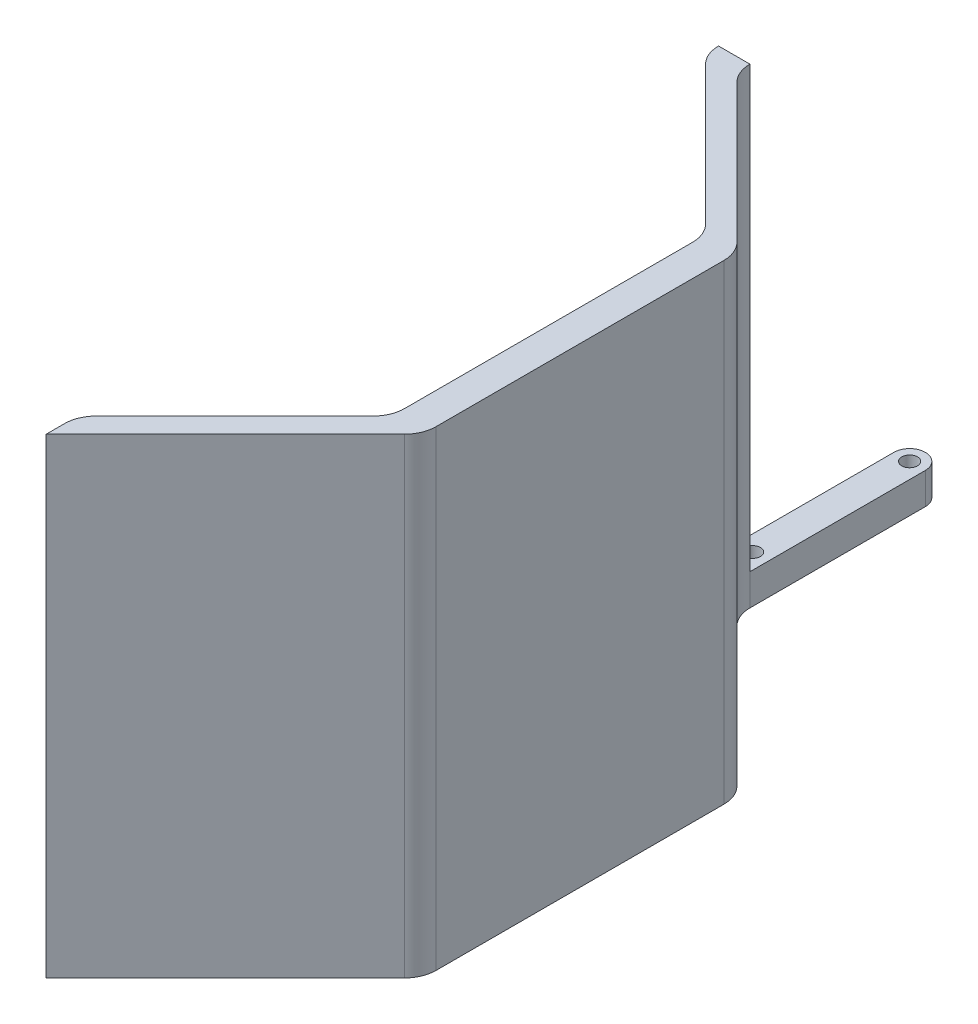
ISO-10303-21;
HEADER;
FILE_DESCRIPTION(('STEP AP214'),'2;1');
FILE_NAME('part.step','',(''),(''),'','','');
FILE_SCHEMA(('AUTOMOTIVE_DESIGN { 1 0 10303 214 1 1 1 1 }'));
ENDSEC;
DATA;
#1=APPLICATION_CONTEXT('core data for automotive mechanical design processes');
#2=APPLICATION_PROTOCOL_DEFINITION('international standard','automotive_design',2000,#1);
#3=PRODUCT_CONTEXT('',#1,'mechanical');
#4=PRODUCT('Part','Part','',(#3));
#5=PRODUCT_RELATED_PRODUCT_CATEGORY('part','',(#4));
#6=PRODUCT_DEFINITION_FORMATION('','',#4);
#7=PRODUCT_DEFINITION_CONTEXT('part definition',#1,'design');
#8=PRODUCT_DEFINITION('design','',#6,#7);
#9=PRODUCT_DEFINITION_SHAPE('','',#8);
#10=(LENGTH_UNIT() NAMED_UNIT(*) SI_UNIT(.MILLI.,.METRE.));
#11=(NAMED_UNIT(*) PLANE_ANGLE_UNIT() SI_UNIT($,.RADIAN.));
#12=(NAMED_UNIT(*) SI_UNIT($,.STERADIAN.) SOLID_ANGLE_UNIT());
#13=UNCERTAINTY_MEASURE_WITH_UNIT(LENGTH_MEASURE(1.E-05),#10,'distance_accuracy_value','');
#14=(GEOMETRIC_REPRESENTATION_CONTEXT(3) GLOBAL_UNCERTAINTY_ASSIGNED_CONTEXT((#13)) GLOBAL_UNIT_ASSIGNED_CONTEXT((#10,
#11,#12)) REPRESENTATION_CONTEXT('',''));
#15=CARTESIAN_POINT('',(0.,0.,0.));
#16=DIRECTION('',(0.,0.,1.));
#17=DIRECTION('',(1.,0.,0.));
#18=AXIS2_PLACEMENT_3D('',#15,#16,#17);
#19=CARTESIAN_POINT('',(83.9293710518805,150.,-1.98835945574279E-13));
#20=DIRECTION('',(1.,0.,0.));
#21=DIRECTION('',(0.,0.,-1.));
#22=AXIS2_PLACEMENT_3D('',#19,#20,#21);
#23=PLANE('',#22);
#24=DIRECTION('',(0.,-1.,0.));
#25=VECTOR('',#24,1.);
#26=CARTESIAN_POINT('',(83.9293710518805,150.,-45.9986158011053));
#27=LINE('',#26,#25);
#28=CARTESIAN_POINT('',(83.9293710518805,9.99999999999998,-45.9986158011053));
#29=VERTEX_POINT('',#28);
#30=CARTESIAN_POINT('',(83.9293710518805,0.,-45.9986158011053));
#31=VERTEX_POINT('',#30);
#32=EDGE_CURVE('E241',#29,#31,#27,.T.);
#33=ORIENTED_EDGE('',*,*,#32,.F.);
#34=DIRECTION('',(0.,0.,-1.));
#35=VECTOR('',#34,1.);
#36=CARTESIAN_POINT('',(83.9293710518805,9.99999999999998,-45.9986158011053));
#37=LINE('',#36,#35);
#38=CARTESIAN_POINT('',(83.9293710518805,9.99999999999998,9.85924857516376));
#39=VERTEX_POINT('',#38);
#40=EDGE_CURVE('E282',#39,#29,#37,.T.);
#41=ORIENTED_EDGE('',*,*,#40,.F.);
#42=DIRECTION('',(0.,-1.,0.));
#43=VECTOR('',#42,1.);
#44=CARTESIAN_POINT('',(83.9293710518805,150.,9.85924857516368));
#45=LINE('',#44,#43);
#46=CARTESIAN_POINT('',(83.9293710518805,0.,9.85924857516368));
#47=VERTEX_POINT('',#46);
#48=EDGE_CURVE('E243',#39,#47,#45,.T.);
#49=ORIENTED_EDGE('',*,*,#48,.T.);
#50=DIRECTION('',(0.,0.,1.));
#51=VECTOR('',#50,1.);
#52=CARTESIAN_POINT('',(83.9293710518805,0.,-1.98835945574279E-13));
#53=LINE('',#52,#51);
#54=EDGE_CURVE('E231',#31,#47,#53,.T.);
#55=ORIENTED_EDGE('',*,*,#54,.F.);
#56=EDGE_LOOP('',(#33,#41,#49,#55));
#57=FACE_BOUND('',#56,.T.);
#58=ADVANCED_FACE('F38',(#57),#23,.T.);
#59=CARTESIAN_POINT('',(78.9293710518805,150.,-45.9986158011053));
#60=DIRECTION('',(0.,-1.,0.));
#61=DIRECTION('',(0.,0.,-1.));
#62=AXIS2_PLACEMENT_3D('',#59,#60,#61);
#63=CYLINDRICAL_SURFACE('',#62,5.);
#64=CARTESIAN_POINT('',(78.9293710518805,9.99999999999998,-45.9986158011053));
#65=DIRECTION('',(0.,1.,0.));
#66=DIRECTION('',(0.,0.,1.));
#67=AXIS2_PLACEMENT_3D('',#64,#65,#66);
#68=CIRCLE('',#67,5.);
#69=CARTESIAN_POINT('',(73.9293710518805,9.99999999999998,-45.9986158011052));
#70=VERTEX_POINT('',#69);
#71=EDGE_CURVE('E285',#29,#70,#68,.T.);
#72=ORIENTED_EDGE('',*,*,#71,.F.);
#73=ORIENTED_EDGE('',*,*,#32,.T.);
#74=CARTESIAN_POINT('',(78.9293710518805,0.,-45.9986158011053));
#75=DIRECTION('',(0.,1.,0.));
#76=DIRECTION('',(0.,0.,1.));
#77=AXIS2_PLACEMENT_3D('',#74,#75,#76);
#78=CIRCLE('',#77,5.);
#79=CARTESIAN_POINT('',(73.9293710518805,0.,-45.9986158011053));
#80=VERTEX_POINT('',#79);
#81=EDGE_CURVE('E234',#31,#80,#78,.T.);
#82=ORIENTED_EDGE('',*,*,#81,.T.);
#83=DIRECTION('',(0.,-1.,0.));
#84=VECTOR('',#83,1.);
#85=CARTESIAN_POINT('',(73.9293710518805,150.,-45.9986158011053));
#86=LINE('',#85,#84);
#87=EDGE_CURVE('E114',#70,#80,#86,.T.);
#88=ORIENTED_EDGE('',*,*,#87,.F.);
#89=EDGE_LOOP('',(#72,#73,#82,#88));
#90=FACE_BOUND('',#89,.T.);
#91=ADVANCED_FACE('F345',(#90),#63,.T.);
#92=CARTESIAN_POINT('',(73.9293710518805,150.,0.));
#93=DIRECTION('',(1.,0.,0.));
#94=DIRECTION('',(0.,0.,-1.));
#95=AXIS2_PLACEMENT_3D('',#92,#93,#94);
#96=PLANE('',#95);
#97=DIRECTION('',(0.,0.,1.));
#98=VECTOR('',#97,1.);
#99=CARTESIAN_POINT('',(73.9293710518805,9.99999999999998,9.85924857516374));
#100=LINE('',#99,#98);
#101=CARTESIAN_POINT('',(73.9293710518805,9.99999999999998,9.85924857516374));
#102=VERTEX_POINT('',#101);
#103=EDGE_CURVE('E288',#70,#102,#100,.T.);
#104=ORIENTED_EDGE('',*,*,#103,.F.);
#105=ORIENTED_EDGE('',*,*,#87,.T.);
#106=DIRECTION('',(0.,0.,1.));
#107=VECTOR('',#106,1.);
#108=CARTESIAN_POINT('',(73.9293710518805,0.,0.));
#109=LINE('',#108,#107);
#110=CARTESIAN_POINT('',(73.9293710518805,0.,9.85924857516374));
#111=VERTEX_POINT('',#110);
#112=EDGE_CURVE('E236',#80,#111,#109,.T.);
#113=ORIENTED_EDGE('',*,*,#112,.T.);
#114=DIRECTION('',(0.,-1.,0.));
#115=VECTOR('',#114,1.);
#116=CARTESIAN_POINT('',(73.9293710518805,150.,9.85924857516374));
#117=LINE('',#116,#115);
#118=EDGE_CURVE('E121',#102,#111,#117,.T.);
#119=ORIENTED_EDGE('',*,*,#118,.F.);
#120=EDGE_LOOP('',(#104,#105,#113,#119));
#121=FACE_BOUND('',#120,.T.);
#122=ADVANCED_FACE('F348',(#121),#96,.F.);
#123=CARTESIAN_POINT('',(83.9293710518805,150.,9.85924857516378));
#124=DIRECTION('',(0.,-1.,0.));
#125=DIRECTION('',(0.,0.,-1.));
#126=AXIS2_PLACEMENT_3D('',#123,#124,#125);
#127=CYLINDRICAL_SURFACE('',#126,10.);
#128=CARTESIAN_POINT('',(83.9293710518805,0.,9.85924857516378));
#129=DIRECTION('',(0.,1.,0.));
#130=DIRECTION('',(0.,0.,1.));
#131=AXIS2_PLACEMENT_3D('',#128,#129,#130);
#132=CIRCLE('',#131,10.);
#133=CARTESIAN_POINT('',(76.8583032400151,0.,16.9303163870293));
#134=VERTEX_POINT('',#133);
#135=EDGE_CURVE('E193',#134,#111,#132,.F.);
#136=ORIENTED_EDGE('',*,*,#135,.F.);
#137=DIRECTION('',(0.,-1.,0.));
#138=VECTOR('',#137,1.);
#139=CARTESIAN_POINT('',(76.8583032400151,150.,16.9303163870293));
#140=LINE('',#139,#138);
#141=CARTESIAN_POINT('',(76.8583032400151,150.,16.9303163870293));
#142=VERTEX_POINT('',#141);
#143=EDGE_CURVE('E11',#142,#134,#140,.T.);
#144=ORIENTED_EDGE('',*,*,#143,.F.);
#145=CARTESIAN_POINT('',(83.9293710518805,150.,9.85924857516378));
#146=DIRECTION('',(0.,1.,0.));
#147=DIRECTION('',(0.,0.,1.));
#148=AXIS2_PLACEMENT_3D('',#145,#146,#147);
#149=CIRCLE('',#148,10.);
#150=CARTESIAN_POINT('',(73.9293710518805,150.,9.85924857516374));
#151=VERTEX_POINT('',#150);
#152=EDGE_CURVE('E238',#142,#151,#149,.F.);
#153=ORIENTED_EDGE('',*,*,#152,.T.);
#154=EDGE_CURVE('E57',#151,#102,#117,.T.);
#155=ORIENTED_EDGE('',*,*,#154,.T.);
#156=ORIENTED_EDGE('',*,*,#118,.T.);
#157=EDGE_LOOP('',(#136,#144,#153,#155,#156));
#158=FACE_BOUND('',#157,.T.);
#159=ADVANCED_FACE('F40',(#158),#127,.T.);
#160=CARTESIAN_POINT('',(29.9639934264929,150.,-29.9639934264929));
#161=DIRECTION('',(0.707106781186548,0.,-0.707106781186547));
#162=DIRECTION('',(-0.707106781186547,0.,-0.707106781186548));
#163=AXIS2_PLACEMENT_3D('',#160,#161,#162);
#164=PLANE('',#163);
#165=DIRECTION('',(0.707106781186547,0.,0.707106781186548));
#166=VECTOR('',#165,1.);
#167=CARTESIAN_POINT('',(29.9639934264929,0.,-29.9639934264929));
#168=LINE('',#167,#166);
#169=CARTESIAN_POINT('',(121.000438863746,0.,61.0724520107602));
#170=VERTEX_POINT('',#169);
#171=EDGE_CURVE('E196',#134,#170,#168,.T.);
#172=ORIENTED_EDGE('',*,*,#171,.T.);
#173=DIRECTION('',(0.,-1.,0.));
#174=VECTOR('',#173,1.);
#175=CARTESIAN_POINT('',(121.000438863746,150.,61.0724520107602));
#176=LINE('',#175,#174);
#177=CARTESIAN_POINT('',(121.000438863746,150.,61.0724520107602));
#178=VERTEX_POINT('',#177);
#179=EDGE_CURVE('E48',#178,#170,#176,.T.);
#180=ORIENTED_EDGE('',*,*,#179,.F.);
#181=DIRECTION('',(0.707106781186547,0.,0.707106781186548));
#182=VECTOR('',#181,1.);
#183=CARTESIAN_POINT('',(29.9639934264929,150.,-29.9639934264929));
#184=LINE('',#183,#182);
#185=EDGE_CURVE('E295',#142,#178,#184,.T.);
#186=ORIENTED_EDGE('',*,*,#185,.F.);
#187=ORIENTED_EDGE('',*,*,#143,.T.);
#188=EDGE_LOOP('',(#172,#180,#186,#187));
#189=FACE_BOUND('',#188,.T.);
#190=ADVANCED_FACE('F352',(#189),#164,.F.);
#191=CARTESIAN_POINT('',(113.929371051881,150.,68.1435198226257));
#192=DIRECTION('',(0.,-1.,0.));
#193=DIRECTION('',(0.,0.,-1.));
#194=AXIS2_PLACEMENT_3D('',#191,#192,#193);
#195=CYLINDRICAL_SURFACE('',#194,9.99999999999999);
#196=CARTESIAN_POINT('',(113.929371051881,0.,68.1435198226257));
#197=DIRECTION('',(0.,1.,0.));
#198=DIRECTION('',(0.,0.,1.));
#199=AXIS2_PLACEMENT_3D('',#196,#197,#198);
#200=CIRCLE('',#199,9.99999999999999);
#201=CARTESIAN_POINT('',(123.92937105188,0.,68.1435198226257));
#202=VERTEX_POINT('',#201);
#203=EDGE_CURVE('E200',#202,#170,#200,.T.);
#204=ORIENTED_EDGE('',*,*,#203,.F.);
#205=DIRECTION('',(0.,-1.,0.));
#206=VECTOR('',#205,1.);
#207=CARTESIAN_POINT('',(123.92937105188,150.,68.1435198226257));
#208=LINE('',#207,#206);
#209=CARTESIAN_POINT('',(123.92937105188,150.,68.1435198226257));
#210=VERTEX_POINT('',#209);
#211=EDGE_CURVE('E265',#210,#202,#208,.T.);
#212=ORIENTED_EDGE('',*,*,#211,.F.);
#213=CARTESIAN_POINT('',(113.929371051881,150.,68.1435198226257));
#214=DIRECTION('',(0.,1.,0.));
#215=DIRECTION('',(0.,0.,1.));
#216=AXIS2_PLACEMENT_3D('',#213,#214,#215);
#217=CIRCLE('',#216,9.99999999999999);
#218=EDGE_CURVE('E297',#210,#178,#217,.T.);
#219=ORIENTED_EDGE('',*,*,#218,.T.);
#220=ORIENTED_EDGE('',*,*,#179,.T.);
#221=EDGE_LOOP('',(#204,#212,#219,#220));
#222=FACE_BOUND('',#221,.T.);
#223=ADVANCED_FACE('F355',(#222),#195,.F.);
#224=CARTESIAN_POINT('',(123.92937105188,150.,0.));
#225=DIRECTION('',(1.,0.,0.));
#226=DIRECTION('',(0.,0.,-1.));
#227=AXIS2_PLACEMENT_3D('',#224,#225,#226);
#228=PLANE('',#227);
#229=DIRECTION('',(0.,0.,1.));
#230=VECTOR('',#229,1.);
#231=CARTESIAN_POINT('',(123.92937105188,0.,0.));
#232=LINE('',#231,#230);
#233=CARTESIAN_POINT('',(123.929371051881,0.,159.859248575164));
#234=VERTEX_POINT('',#233);
#235=EDGE_CURVE('E203',#202,#234,#232,.T.);
#236=ORIENTED_EDGE('',*,*,#235,.T.);
#237=DIRECTION('',(0.,-1.,0.));
#238=VECTOR('',#237,1.);
#239=CARTESIAN_POINT('',(123.929371051881,150.,159.859248575164));
#240=LINE('',#239,#238);
#241=CARTESIAN_POINT('',(123.929371051881,150.,159.859248575164));
#242=VERTEX_POINT('',#241);
#243=EDGE_CURVE('E262',#242,#234,#240,.T.);
#244=ORIENTED_EDGE('',*,*,#243,.F.);
#245=DIRECTION('',(0.,0.,1.));
#246=VECTOR('',#245,1.);
#247=CARTESIAN_POINT('',(123.92937105188,150.,0.));
#248=LINE('',#247,#246);
#249=EDGE_CURVE('E300',#210,#242,#248,.T.);
#250=ORIENTED_EDGE('',*,*,#249,.F.);
#251=ORIENTED_EDGE('',*,*,#211,.T.);
#252=EDGE_LOOP('',(#236,#244,#250,#251));
#253=FACE_BOUND('',#252,.T.);
#254=ADVANCED_FACE('F360',(#253),#228,.F.);
#255=CARTESIAN_POINT('',(113.929371051881,150.,159.859248575164));
#256=DIRECTION('',(0.,-1.,0.));
#257=DIRECTION('',(0.,0.,-1.));
#258=AXIS2_PLACEMENT_3D('',#255,#256,#257);
#259=CYLINDRICAL_SURFACE('',#258,10.);
#260=CARTESIAN_POINT('',(113.929371051881,0.,159.859248575164));
#261=DIRECTION('',(0.,1.,0.));
#262=DIRECTION('',(0.,0.,1.));
#263=AXIS2_PLACEMENT_3D('',#260,#261,#262);
#264=CIRCLE('',#263,10.);
#265=CARTESIAN_POINT('',(121.000438863746,0.,166.930316387029));
#266=VERTEX_POINT('',#265);
#267=EDGE_CURVE('E205',#234,#266,#264,.F.);
#268=ORIENTED_EDGE('',*,*,#267,.T.);
#269=DIRECTION('',(0.,-1.,0.));
#270=VECTOR('',#269,1.);
#271=CARTESIAN_POINT('',(121.000438863746,150.,166.930316387029));
#272=LINE('',#271,#270);
#273=CARTESIAN_POINT('',(121.000438863746,150.,166.930316387029));
#274=VERTEX_POINT('',#273);
#275=EDGE_CURVE('E259',#274,#266,#272,.T.);
#276=ORIENTED_EDGE('',*,*,#275,.F.);
#277=CARTESIAN_POINT('',(113.929371051881,150.,159.859248575164));
#278=DIRECTION('',(0.,1.,0.));
#279=DIRECTION('',(0.,0.,1.));
#280=AXIS2_PLACEMENT_3D('',#277,#278,#279);
#281=CIRCLE('',#280,10.);
#282=EDGE_CURVE('E302',#242,#274,#281,.F.);
#283=ORIENTED_EDGE('',*,*,#282,.F.);
#284=ORIENTED_EDGE('',*,*,#243,.T.);
#285=EDGE_LOOP('',(#268,#276,#283,#284));
#286=FACE_BOUND('',#285,.T.);
#287=ADVANCED_FACE('F367',(#286),#259,.F.);
#288=CARTESIAN_POINT('',(143.965377625386,150.,143.96537762539));
#289=DIRECTION('',(0.707106781186537,0.,0.707106781186558));
#290=DIRECTION('',(0.707106781186558,0.,-0.707106781186537));
#291=AXIS2_PLACEMENT_3D('',#288,#289,#290);
#292=PLANE('',#291);
#293=DIRECTION('',(-0.707106781186558,0.,0.707106781186537));
#294=VECTOR('',#293,1.);
#295=CARTESIAN_POINT('',(143.965377625386,0.,143.96537762539));
#296=LINE('',#295,#294);
#297=CARTESIAN_POINT('',(76.8583032400138,0.,211.07245201076));
#298=VERTEX_POINT('',#297);
#299=EDGE_CURVE('E207',#266,#298,#296,.T.);
#300=ORIENTED_EDGE('',*,*,#299,.T.);
#301=DIRECTION('',(0.,-1.,0.));
#302=VECTOR('',#301,1.);
#303=CARTESIAN_POINT('',(76.8583032400138,150.,211.07245201076));
#304=LINE('',#303,#302);
#305=CARTESIAN_POINT('',(76.8583032400138,150.,211.07245201076));
#306=VERTEX_POINT('',#305);
#307=EDGE_CURVE('E257',#306,#298,#304,.T.);
#308=ORIENTED_EDGE('',*,*,#307,.F.);
#309=DIRECTION('',(-0.707106781186558,0.,0.707106781186537));
#310=VECTOR('',#309,1.);
#311=CARTESIAN_POINT('',(143.965377625386,150.,143.96537762539));
#312=LINE('',#311,#310);
#313=EDGE_CURVE('E304',#274,#306,#312,.T.);
#314=ORIENTED_EDGE('',*,*,#313,.F.);
#315=ORIENTED_EDGE('',*,*,#275,.T.);
#316=EDGE_LOOP('',(#300,#308,#314,#315));
#317=FACE_BOUND('',#316,.T.);
#318=ADVANCED_FACE('F371',(#317),#292,.F.);
#319=CARTESIAN_POINT('',(83.9293710518805,150.,218.143519822626));
#320=DIRECTION('',(0.,-1.,0.));
#321=DIRECTION('',(0.,0.,-1.));
#322=AXIS2_PLACEMENT_3D('',#319,#320,#321);
#323=CYLINDRICAL_SURFACE('',#322,10.0000000000005);
#324=CARTESIAN_POINT('',(83.9293710518805,0.,218.143519822626));
#325=DIRECTION('',(0.,1.,0.));
#326=DIRECTION('',(0.,0.,1.));
#327=AXIS2_PLACEMENT_3D('',#324,#325,#326);
#328=CIRCLE('',#327,10.0000000000005);
#329=CARTESIAN_POINT('',(73.9293710518805,0.,218.143519822626));
#330=VERTEX_POINT('',#329);
#331=EDGE_CURVE('E210',#330,#298,#328,.F.);
#332=ORIENTED_EDGE('',*,*,#331,.F.);
#333=DIRECTION('',(0.,-1.,0.));
#334=VECTOR('',#333,1.);
#335=CARTESIAN_POINT('',(73.9293710518805,150.,218.143519822626));
#336=LINE('',#335,#334);
#337=CARTESIAN_POINT('',(73.9293710518805,150.,218.143519822626));
#338=VERTEX_POINT('',#337);
#339=EDGE_CURVE('E255',#338,#330,#336,.T.);
#340=ORIENTED_EDGE('',*,*,#339,.F.);
#341=CARTESIAN_POINT('',(83.9293710518805,150.,218.143519822626));
#342=DIRECTION('',(0.,1.,0.));
#343=DIRECTION('',(0.,0.,1.));
#344=AXIS2_PLACEMENT_3D('',#341,#342,#343);
#345=CIRCLE('',#344,10.0000000000005);
#346=EDGE_CURVE('E306',#338,#306,#345,.F.);
#347=ORIENTED_EDGE('',*,*,#346,.T.);
#348=ORIENTED_EDGE('',*,*,#307,.T.);
#349=EDGE_LOOP('',(#332,#340,#347,#348));
#350=FACE_BOUND('',#349,.T.);
#351=ADVANCED_FACE('F374',(#350),#323,.T.);
#352=CARTESIAN_POINT('',(73.9293710518805,150.,0.));
#353=DIRECTION('',(-1.,0.,0.));
#354=DIRECTION('',(0.,0.,1.));
#355=AXIS2_PLACEMENT_3D('',#352,#353,#354);
#356=PLANE('',#355);
#357=DIRECTION('',(0.,0.,-1.));
#358=VECTOR('',#357,1.);
#359=CARTESIAN_POINT('',(73.9293710518805,0.,0.));
#360=LINE('',#359,#358);
#361=CARTESIAN_POINT('',(73.9293710518806,0.,224.001384198897));
#362=VERTEX_POINT('',#361);
#363=EDGE_CURVE('E213',#362,#330,#360,.T.);
#364=ORIENTED_EDGE('',*,*,#363,.F.);
#365=DIRECTION('',(0.,-1.,0.));
#366=VECTOR('',#365,1.);
#367=CARTESIAN_POINT('',(73.9293710518806,150.,224.001384198897));
#368=LINE('',#367,#366);
#369=CARTESIAN_POINT('',(73.9293710518806,150.,224.001384198897));
#370=VERTEX_POINT('',#369);
#371=EDGE_CURVE('E253',#370,#362,#368,.T.);
#372=ORIENTED_EDGE('',*,*,#371,.F.);
#373=DIRECTION('',(0.,0.,-1.));
#374=VECTOR('',#373,1.);
#375=CARTESIAN_POINT('',(73.9293710518805,150.,0.));
#376=LINE('',#375,#374);
#377=EDGE_CURVE('E309',#370,#338,#376,.T.);
#378=ORIENTED_EDGE('',*,*,#377,.T.);
#379=ORIENTED_EDGE('',*,*,#339,.T.);
#380=EDGE_LOOP('',(#364,#372,#378,#379));
#381=FACE_BOUND('',#380,.T.);
#382=ADVANCED_FACE('F379',(#381),#356,.T.);
#383=CARTESIAN_POINT('',(148.96537762539,150.,148.965377625386));
#384=DIRECTION('',(0.707106781186556,0.,0.707106781186539));
#385=DIRECTION('',(0.707106781186539,0.,-0.707106781186556));
#386=AXIS2_PLACEMENT_3D('',#383,#384,#385);
#387=PLANE('',#386);
#388=DIRECTION('',(-0.707106781186539,0.,0.707106781186556));
#389=VECTOR('',#388,1.);
#390=CARTESIAN_POINT('',(148.96537762539,0.,148.965377625386));
#391=LINE('',#390,#389);
#392=CARTESIAN_POINT('',(131.000438863747,0.,166.930316387029));
#393=VERTEX_POINT('',#392);
#394=EDGE_CURVE('E216',#393,#362,#391,.T.);
#395=ORIENTED_EDGE('',*,*,#394,.F.);
#396=DIRECTION('',(0.,-1.,0.));
#397=VECTOR('',#396,1.);
#398=CARTESIAN_POINT('',(131.000438863747,150.,166.930316387029));
#399=LINE('',#398,#397);
#400=CARTESIAN_POINT('',(131.000438863747,150.,166.930316387029));
#401=VERTEX_POINT('',#400);
#402=EDGE_CURVE('E251',#401,#393,#399,.T.);
#403=ORIENTED_EDGE('',*,*,#402,.F.);
#404=DIRECTION('',(-0.707106781186539,0.,0.707106781186556));
#405=VECTOR('',#404,1.);
#406=CARTESIAN_POINT('',(148.96537762539,150.,148.965377625386));
#407=LINE('',#406,#405);
#408=EDGE_CURVE('E312',#401,#370,#407,.T.);
#409=ORIENTED_EDGE('',*,*,#408,.T.);
#410=ORIENTED_EDGE('',*,*,#371,.T.);
#411=EDGE_LOOP('',(#395,#403,#409,#410));
#412=FACE_BOUND('',#411,.T.);
#413=ADVANCED_FACE('F382',(#412),#387,.T.);
#414=CARTESIAN_POINT('',(123.929371051882,150.,159.859248575164));
#415=DIRECTION('',(0.,-1.,0.));
#416=DIRECTION('',(0.,0.,-1.));
#417=AXIS2_PLACEMENT_3D('',#414,#415,#416);
#418=CYLINDRICAL_SURFACE('',#417,10.);
#419=CARTESIAN_POINT('',(123.929371051882,0.,159.859248575164));
#420=DIRECTION('',(0.,1.,0.));
#421=DIRECTION('',(0.,0.,1.));
#422=AXIS2_PLACEMENT_3D('',#419,#420,#421);
#423=CIRCLE('',#422,10.);
#424=CARTESIAN_POINT('',(133.929371051882,0.,159.859248575164));
#425=VERTEX_POINT('',#424);
#426=EDGE_CURVE('E219',#425,#393,#423,.F.);
#427=ORIENTED_EDGE('',*,*,#426,.F.);
#428=DIRECTION('',(0.,-1.,0.));
#429=VECTOR('',#428,1.);
#430=CARTESIAN_POINT('',(133.929371051882,150.,159.859248575164));
#431=LINE('',#430,#429);
#432=CARTESIAN_POINT('',(133.929371051882,150.,159.859248575164));
#433=VERTEX_POINT('',#432);
#434=EDGE_CURVE('E249',#433,#425,#431,.T.);
#435=ORIENTED_EDGE('',*,*,#434,.F.);
#436=CARTESIAN_POINT('',(123.929371051882,150.,159.859248575164));
#437=DIRECTION('',(0.,1.,0.));
#438=DIRECTION('',(0.,0.,1.));
#439=AXIS2_PLACEMENT_3D('',#436,#437,#438);
#440=CIRCLE('',#439,10.);
#441=EDGE_CURVE('E315',#433,#401,#440,.F.);
#442=ORIENTED_EDGE('',*,*,#441,.T.);
#443=ORIENTED_EDGE('',*,*,#402,.T.);
#444=EDGE_LOOP('',(#427,#435,#442,#443));
#445=FACE_BOUND('',#444,.T.);
#446=ADVANCED_FACE('F384',(#445),#418,.T.);
#447=CARTESIAN_POINT('',(133.929371051882,150.,0.));
#448=DIRECTION('',(1.,0.,0.));
#449=DIRECTION('',(0.,0.,-1.));
#450=AXIS2_PLACEMENT_3D('',#447,#448,#449);
#451=PLANE('',#450);
#452=DIRECTION('',(0.,0.,1.));
#453=VECTOR('',#452,1.);
#454=CARTESIAN_POINT('',(133.929371051882,0.,0.));
#455=LINE('',#454,#453);
#456=CARTESIAN_POINT('',(133.929371051882,0.,68.1435198226258));
#457=VERTEX_POINT('',#456);
#458=EDGE_CURVE('E222',#457,#425,#455,.T.);
#459=ORIENTED_EDGE('',*,*,#458,.F.);
#460=DIRECTION('',(0.,-1.,0.));
#461=VECTOR('',#460,1.);
#462=CARTESIAN_POINT('',(133.929371051882,150.,68.1435198226258));
#463=LINE('',#462,#461);
#464=CARTESIAN_POINT('',(133.929371051882,150.,68.1435198226258));
#465=VERTEX_POINT('',#464);
#466=EDGE_CURVE('E173',#465,#457,#463,.T.);
#467=ORIENTED_EDGE('',*,*,#466,.F.);
#468=DIRECTION('',(0.,0.,1.));
#469=VECTOR('',#468,1.);
#470=CARTESIAN_POINT('',(133.929371051882,150.,0.));
#471=LINE('',#470,#469);
#472=EDGE_CURVE('E184',#465,#433,#471,.T.);
#473=ORIENTED_EDGE('',*,*,#472,.T.);
#474=ORIENTED_EDGE('',*,*,#434,.T.);
#475=EDGE_LOOP('',(#459,#467,#473,#474));
#476=FACE_BOUND('',#475,.T.);
#477=ADVANCED_FACE('F319',(#476),#451,.T.);
#478=CARTESIAN_POINT('',(123.929371051882,150.,68.1435198226257));
#479=DIRECTION('',(0.,-1.,0.));
#480=DIRECTION('',(0.,0.,-1.));
#481=AXIS2_PLACEMENT_3D('',#478,#479,#480);
#482=CYLINDRICAL_SURFACE('',#481,10.);
#483=CARTESIAN_POINT('',(123.929371051882,0.,68.1435198226257));
#484=DIRECTION('',(0.,1.,0.));
#485=DIRECTION('',(0.,0.,1.));
#486=AXIS2_PLACEMENT_3D('',#483,#484,#485);
#487=CIRCLE('',#486,10.);
#488=CARTESIAN_POINT('',(131.000438863747,0.,61.0724520107602));
#489=VERTEX_POINT('',#488);
#490=EDGE_CURVE('E168',#489,#457,#487,.F.);
#491=ORIENTED_EDGE('',*,*,#490,.F.);
#492=DIRECTION('',(0.,-1.,0.));
#493=VECTOR('',#492,1.);
#494=CARTESIAN_POINT('',(131.000438863747,150.,61.0724520107602));
#495=LINE('',#494,#493);
#496=CARTESIAN_POINT('',(131.000438863747,150.,61.0724520107602));
#497=VERTEX_POINT('',#496);
#498=EDGE_CURVE('E163',#497,#489,#495,.T.);
#499=ORIENTED_EDGE('',*,*,#498,.F.);
#500=CARTESIAN_POINT('',(123.929371051882,150.,68.1435198226257));
#501=DIRECTION('',(0.,1.,0.));
#502=DIRECTION('',(0.,0.,1.));
#503=AXIS2_PLACEMENT_3D('',#500,#501,#502);
#504=CIRCLE('',#503,10.);
#505=EDGE_CURVE('E166',#497,#465,#504,.F.);
#506=ORIENTED_EDGE('',*,*,#505,.T.);
#507=ORIENTED_EDGE('',*,*,#466,.T.);
#508=EDGE_LOOP('',(#491,#499,#506,#507));
#509=FACE_BOUND('',#508,.T.);
#510=ADVANCED_FACE('F165',(#509),#482,.T.);
#511=CARTESIAN_POINT('',(34.9639934264919,150.,-34.9639934264927));
#512=DIRECTION('',(0.707106781186539,0.,-0.707106781186556));
#513=DIRECTION('',(-0.707106781186556,0.,-0.707106781186539));
#514=AXIS2_PLACEMENT_3D('',#511,#512,#513);
#515=PLANE('',#514);
#516=DIRECTION('',(0.707106781186556,0.,0.707106781186539));
#517=VECTOR('',#516,1.);
#518=CARTESIAN_POINT('',(34.9639934264919,0.,-34.9639934264927));
#519=LINE('',#518,#517);
#520=CARTESIAN_POINT('',(86.8583032400151,0.,16.9303163870293));
#521=VERTEX_POINT('',#520);
#522=EDGE_CURVE('E226',#521,#489,#519,.T.);
#523=ORIENTED_EDGE('',*,*,#522,.F.);
#524=DIRECTION('',(0.,-1.,0.));
#525=VECTOR('',#524,1.);
#526=CARTESIAN_POINT('',(86.8583032400151,150.,16.9303163870293));
#527=LINE('',#526,#525);
#528=CARTESIAN_POINT('',(86.8583032400151,150.,16.9303163870293));
#529=VERTEX_POINT('',#528);
#530=EDGE_CURVE('E174',#529,#521,#527,.T.);
#531=ORIENTED_EDGE('',*,*,#530,.F.);
#532=DIRECTION('',(0.707106781186556,0.,0.707106781186539));
#533=VECTOR('',#532,1.);
#534=CARTESIAN_POINT('',(34.9639934264919,150.,-34.9639934264927));
#535=LINE('',#534,#533);
#536=EDGE_CURVE('E181',#529,#497,#535,.T.);
#537=ORIENTED_EDGE('',*,*,#536,.T.);
#538=ORIENTED_EDGE('',*,*,#498,.T.);
#539=EDGE_LOOP('',(#523,#531,#537,#538));
#540=FACE_BOUND('',#539,.T.);
#541=ADVANCED_FACE('F186',(#540),#515,.T.);
#542=CARTESIAN_POINT('',(93.9293710518805,150.,9.85924857516369));
#543=DIRECTION('',(0.,-1.,0.));
#544=DIRECTION('',(0.,0.,-1.));
#545=AXIS2_PLACEMENT_3D('',#542,#543,#544);
#546=CYLINDRICAL_SURFACE('',#545,10.);
#547=CARTESIAN_POINT('',(93.9293710518805,0.,9.85924857516369));
#548=DIRECTION('',(0.,1.,0.));
#549=DIRECTION('',(0.,0.,1.));
#550=AXIS2_PLACEMENT_3D('',#547,#548,#549);
#551=CIRCLE('',#550,10.);
#552=EDGE_CURVE('E228',#521,#47,#551,.F.);
#553=ORIENTED_EDGE('',*,*,#552,.T.);
#554=ORIENTED_EDGE('',*,*,#48,.F.);
#555=CARTESIAN_POINT('',(83.9293710518805,150.,9.85924857516376));
#556=VERTEX_POINT('',#555);
#557=EDGE_CURVE('E244',#556,#39,#45,.T.);
#558=ORIENTED_EDGE('',*,*,#557,.F.);
#559=CARTESIAN_POINT('',(93.9293710518805,150.,9.85924857516369));
#560=DIRECTION('',(0.,1.,0.));
#561=DIRECTION('',(0.,0.,1.));
#562=AXIS2_PLACEMENT_3D('',#559,#560,#561);
#563=CIRCLE('',#562,10.);
#564=EDGE_CURVE('E188',#529,#556,#563,.F.);
#565=ORIENTED_EDGE('',*,*,#564,.F.);
#566=ORIENTED_EDGE('',*,*,#530,.T.);
#567=EDGE_LOOP('',(#553,#554,#558,#565,#566));
#568=FACE_BOUND('',#567,.T.);
#569=ADVANCED_FACE('F328',(#568),#546,.F.);
#570=CARTESIAN_POINT('',(0.,150.,0.));
#571=DIRECTION('',(0.,1.,0.));
#572=DIRECTION('',(0.,0.,1.));
#573=AXIS2_PLACEMENT_3D('',#570,#571,#572);
#574=PLANE('',#573);
#575=DIRECTION('',(1.,0.,0.));
#576=VECTOR('',#575,1.);
#577=CARTESIAN_POINT('',(83.9293710518805,150.,9.85924857516376));
#578=LINE('',#577,#576);
#579=EDGE_CURVE('E273',#151,#556,#578,.T.);
#580=ORIENTED_EDGE('',*,*,#579,.F.);
#581=ORIENTED_EDGE('',*,*,#152,.F.);
#582=ORIENTED_EDGE('',*,*,#185,.T.);
#583=ORIENTED_EDGE('',*,*,#218,.F.);
#584=ORIENTED_EDGE('',*,*,#249,.T.);
#585=ORIENTED_EDGE('',*,*,#282,.T.);
#586=ORIENTED_EDGE('',*,*,#313,.T.);
#587=ORIENTED_EDGE('',*,*,#346,.F.);
#588=ORIENTED_EDGE('',*,*,#377,.F.);
#589=ORIENTED_EDGE('',*,*,#408,.F.);
#590=ORIENTED_EDGE('',*,*,#441,.F.);
#591=ORIENTED_EDGE('',*,*,#472,.F.);
#592=ORIENTED_EDGE('',*,*,#505,.F.);
#593=ORIENTED_EDGE('',*,*,#536,.F.);
#594=ORIENTED_EDGE('',*,*,#564,.T.);
#595=EDGE_LOOP('',(#580,#581,#582,#583,#584,#585,#586,#587,#588,#589,#590,#591,#592,#593,#594));
#596=FACE_BOUND('',#595,.T.);
#597=ADVANCED_FACE('F179',(#596),#574,.T.);
#598=CARTESIAN_POINT('',(0.,0.,0.));
#599=DIRECTION('',(0.,1.,0.));
#600=DIRECTION('',(0.,0.,1.));
#601=AXIS2_PLACEMENT_3D('',#598,#599,#600);
#602=PLANE('',#601);
#603=CARTESIAN_POINT('',(78.9293710518805,0.,-45.9986158011053));
#604=DIRECTION('',(0.,-1.,0.));
#605=DIRECTION('',(0.,0.,-1.));
#606=AXIS2_PLACEMENT_3D('',#603,#604,#605);
#607=CIRCLE('',#606,2.5);
#608=CARTESIAN_POINT('',(78.9293710518805,0.,-48.4986158011053));
#609=VERTEX_POINT('',#608);
#610=EDGE_CURVE('E269',#609,#609,#607,.T.);
#611=ORIENTED_EDGE('',*,*,#610,.F.);
#612=EDGE_LOOP('',(#611));
#613=FACE_BOUND('',#612,.T.);
#614=CARTESIAN_POINT('',(78.9293710518805,0.,4.00138419889474));
#615=DIRECTION('',(0.,-1.,0.));
#616=DIRECTION('',(0.,0.,-1.));
#617=AXIS2_PLACEMENT_3D('',#614,#615,#616);
#618=CIRCLE('',#617,2.5);
#619=CARTESIAN_POINT('',(78.9293710518805,0.,1.50138419889475));
#620=VERTEX_POINT('',#619);
#621=EDGE_CURVE('E275',#620,#620,#618,.T.);
#622=ORIENTED_EDGE('',*,*,#621,.F.);
#623=EDGE_LOOP('',(#622));
#624=FACE_BOUND('',#623,.T.);
#625=ORIENTED_EDGE('',*,*,#135,.T.);
#626=ORIENTED_EDGE('',*,*,#112,.F.);
#627=ORIENTED_EDGE('',*,*,#81,.F.);
#628=ORIENTED_EDGE('',*,*,#54,.T.);
#629=ORIENTED_EDGE('',*,*,#552,.F.);
#630=ORIENTED_EDGE('',*,*,#522,.T.);
#631=ORIENTED_EDGE('',*,*,#490,.T.);
#632=ORIENTED_EDGE('',*,*,#458,.T.);
#633=ORIENTED_EDGE('',*,*,#426,.T.);
#634=ORIENTED_EDGE('',*,*,#394,.T.);
#635=ORIENTED_EDGE('',*,*,#363,.T.);
#636=ORIENTED_EDGE('',*,*,#331,.T.);
#637=ORIENTED_EDGE('',*,*,#299,.F.);
#638=ORIENTED_EDGE('',*,*,#267,.F.);
#639=ORIENTED_EDGE('',*,*,#235,.F.);
#640=ORIENTED_EDGE('',*,*,#203,.T.);
#641=ORIENTED_EDGE('',*,*,#171,.F.);
#642=EDGE_LOOP('',(#625,#626,#627,#628,#629,#630,#631,#632,#633,#634,#635,#636,#637,#638,#639,
#640,#641));
#643=FACE_BOUND('',#642,.T.);
#644=ADVANCED_FACE('F322',(#613,#624,#643),#602,.F.);
#645=CARTESIAN_POINT('',(83.9293710518805,9.99999999999998,9.85924857516376));
#646=DIRECTION('',(0.,0.,1.));
#647=DIRECTION('',(1.,0.,0.));
#648=AXIS2_PLACEMENT_3D('',#645,#646,#647);
#649=PLANE('',#648);
#650=ORIENTED_EDGE('',*,*,#579,.T.);
#651=ORIENTED_EDGE('',*,*,#557,.T.);
#652=DIRECTION('',(1.,0.,0.));
#653=VECTOR('',#652,1.);
#654=CARTESIAN_POINT('',(83.9293710518805,9.99999999999998,9.85924857516376));
#655=LINE('',#654,#653);
#656=EDGE_CURVE('E197',#102,#39,#655,.T.);
#657=ORIENTED_EDGE('',*,*,#656,.F.);
#658=ORIENTED_EDGE('',*,*,#154,.F.);
#659=EDGE_LOOP('',(#650,#651,#657,#658));
#660=FACE_BOUND('',#659,.T.);
#661=ADVANCED_FACE('F340',(#660),#649,.F.);
#662=CARTESIAN_POINT('',(78.9293710518805,9.99999999999998,-45.9986158011053));
#663=DIRECTION('',(0.,1.,0.));
#664=DIRECTION('',(0.,0.,1.));
#665=AXIS2_PLACEMENT_3D('',#662,#663,#664);
#666=PLANE('',#665);
#667=CARTESIAN_POINT('',(78.9293710518805,9.99999999999998,-45.9986158011053));
#668=DIRECTION('',(0.,1.,0.));
#669=DIRECTION('',(0.,0.,1.));
#670=AXIS2_PLACEMENT_3D('',#667,#668,#669);
#671=CIRCLE('',#670,2.5);
#672=CARTESIAN_POINT('',(78.9293710518805,9.99999999999998,-43.4986158011053));
#673=VERTEX_POINT('',#672);
#674=EDGE_CURVE('E42',#673,#673,#671,.T.);
#675=ORIENTED_EDGE('',*,*,#674,.F.);
#676=EDGE_LOOP('',(#675));
#677=FACE_BOUND('',#676,.T.);
#678=CARTESIAN_POINT('',(78.9293710518805,9.99999999999998,4.00138419889474));
#679=DIRECTION('',(0.,1.,0.));
#680=DIRECTION('',(0.,0.,1.));
#681=AXIS2_PLACEMENT_3D('',#678,#679,#680);
#682=CIRCLE('',#681,2.5);
#683=CARTESIAN_POINT('',(78.9293710518805,9.99999999999998,6.50138419889474));
#684=VERTEX_POINT('',#683);
#685=EDGE_CURVE('E267',#684,#684,#682,.T.);
#686=ORIENTED_EDGE('',*,*,#685,.F.);
#687=EDGE_LOOP('',(#686));
#688=FACE_BOUND('',#687,.T.);
#689=ORIENTED_EDGE('',*,*,#40,.T.);
#690=ORIENTED_EDGE('',*,*,#71,.T.);
#691=ORIENTED_EDGE('',*,*,#103,.T.);
#692=ORIENTED_EDGE('',*,*,#656,.T.);
#693=EDGE_LOOP('',(#689,#690,#691,#692));
#694=FACE_BOUND('',#693,.T.);
#695=ADVANCED_FACE('F341',(#677,#688,#694),#666,.T.);
#696=CARTESIAN_POINT('',(78.9293710518805,150.,4.00138419889474));
#697=DIRECTION('',(0.,-1.,0.));
#698=DIRECTION('',(0.,0.,-1.));
#699=AXIS2_PLACEMENT_3D('',#696,#697,#698);
#700=CYLINDRICAL_SURFACE('',#699,2.5);
#701=ORIENTED_EDGE('',*,*,#685,.T.);
#702=EDGE_LOOP('',(#701));
#703=FACE_BOUND('',#702,.T.);
#704=ORIENTED_EDGE('',*,*,#621,.T.);
#705=EDGE_LOOP('',(#704));
#706=FACE_BOUND('',#705,.T.);
#707=ADVANCED_FACE('F478',(#703,#706),#700,.F.);
#708=CARTESIAN_POINT('',(78.9293710518805,150.,-45.9986158011053));
#709=DIRECTION('',(0.,-1.,0.));
#710=DIRECTION('',(0.,0.,-1.));
#711=AXIS2_PLACEMENT_3D('',#708,#709,#710);
#712=CYLINDRICAL_SURFACE('',#711,2.5);
#713=ORIENTED_EDGE('',*,*,#674,.T.);
#714=EDGE_LOOP('',(#713));
#715=FACE_BOUND('',#714,.T.);
#716=ORIENTED_EDGE('',*,*,#610,.T.);
#717=EDGE_LOOP('',(#716));
#718=FACE_BOUND('',#717,.T.);
#719=ADVANCED_FACE('F488',(#715,#718),#712,.F.);
#720=CLOSED_SHELL('',(#58,#91,#122,#159,#190,#223,#254,#287,#318,#351,#382,#413,#446,#477,#510,
#541,#569,#597,#644,#661,#695,#707,#719));
#721=MANIFOLD_SOLID_BREP('B2',#720);
#722=ADVANCED_BREP_SHAPE_REPRESENTATION('',(#18,#721),#14);
#723=SHAPE_DEFINITION_REPRESENTATION(#9,#722);
ENDSEC;
END-ISO-10303-21;
